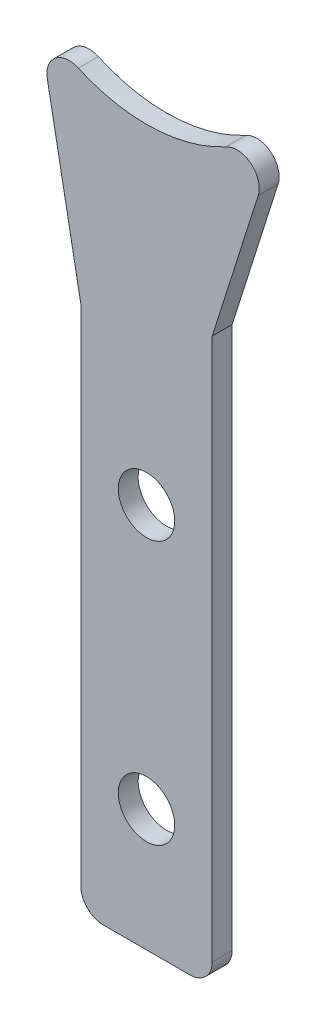
ISO-10303-21;
HEADER;
FILE_DESCRIPTION(('STEP AP214'),'2;1');
FILE_NAME('part.step','',(''),(''),'','','');
FILE_SCHEMA(('AUTOMOTIVE_DESIGN { 1 0 10303 214 1 1 1 1 }'));
ENDSEC;
DATA;
#1=APPLICATION_CONTEXT('core data for automotive mechanical design processes');
#2=APPLICATION_PROTOCOL_DEFINITION('international standard','automotive_design',2000,#1);
#3=PRODUCT_CONTEXT('',#1,'mechanical');
#4=PRODUCT('Part','Part','',(#3));
#5=PRODUCT_RELATED_PRODUCT_CATEGORY('part','',(#4));
#6=PRODUCT_DEFINITION_FORMATION('','',#4);
#7=PRODUCT_DEFINITION_CONTEXT('part definition',#1,'design');
#8=PRODUCT_DEFINITION('design','',#6,#7);
#9=PRODUCT_DEFINITION_SHAPE('','',#8);
#10=(LENGTH_UNIT() NAMED_UNIT(*) SI_UNIT(.MILLI.,.METRE.));
#11=(NAMED_UNIT(*) PLANE_ANGLE_UNIT() SI_UNIT($,.RADIAN.));
#12=(NAMED_UNIT(*) SI_UNIT($,.STERADIAN.) SOLID_ANGLE_UNIT());
#13=UNCERTAINTY_MEASURE_WITH_UNIT(LENGTH_MEASURE(1.E-05),#10,'distance_accuracy_value','');
#14=(GEOMETRIC_REPRESENTATION_CONTEXT(3) GLOBAL_UNCERTAINTY_ASSIGNED_CONTEXT((#13)) GLOBAL_UNIT_ASSIGNED_CONTEXT((#10,
#11,#12)) REPRESENTATION_CONTEXT('',''));
#15=CARTESIAN_POINT('',(0.,0.,0.));
#16=DIRECTION('',(0.,0.,1.));
#17=DIRECTION('',(1.,0.,0.));
#18=AXIS2_PLACEMENT_3D('',#15,#16,#17);
#19=CARTESIAN_POINT('',(0.,-25.6178665511832,1.5875));
#20=DIRECTION('',(0.,1.,0.));
#21=DIRECTION('',(0.,0.,1.));
#22=AXIS2_PLACEMENT_3D('',#19,#20,#21);
#23=PLANE('',#22);
#24=DIRECTION('',(1.,0.,0.));
#25=VECTOR('',#24,1.);
#26=CARTESIAN_POINT('',(0.,-25.6178665511832,0.));
#27=LINE('',#26,#25);
#28=CARTESIAN_POINT('',(-1.30092409853893,-25.6178665511832,0.));
#29=VERTEX_POINT('',#28);
#30=CARTESIAN_POINT('',(5.62126081661469,-25.6178665511832,0.));
#31=VERTEX_POINT('',#30);
#32=EDGE_CURVE('E156',#29,#31,#27,.T.);
#33=ORIENTED_EDGE('',*,*,#32,.T.);
#34=DIRECTION('',(0.,0.,-1.));
#35=VECTOR('',#34,1.);
#36=CARTESIAN_POINT('',(5.62126081661469,-25.6178665511832,1.5875));
#37=LINE('',#36,#35);
#38=CARTESIAN_POINT('',(5.62126081661469,-25.6178665511832,1.5875));
#39=VERTEX_POINT('',#38);
#40=EDGE_CURVE('E185',#31,#39,#37,.F.);
#41=ORIENTED_EDGE('',*,*,#40,.T.);
#42=DIRECTION('',(1.,0.,0.));
#43=VECTOR('',#42,1.);
#44=CARTESIAN_POINT('',(0.,-25.6178665511832,1.5875));
#45=LINE('',#44,#43);
#46=CARTESIAN_POINT('',(-1.30092409853893,-25.6178665511832,1.5875));
#47=VERTEX_POINT('',#46);
#48=EDGE_CURVE('E131',#47,#39,#45,.T.);
#49=ORIENTED_EDGE('',*,*,#48,.F.);
#50=DIRECTION('',(0.,0.,-1.));
#51=VECTOR('',#50,1.);
#52=CARTESIAN_POINT('',(-1.30092409853893,-25.6178665511832,0.));
#53=LINE('',#52,#51);
#54=EDGE_CURVE('E182',#47,#29,#53,.T.);
#55=ORIENTED_EDGE('',*,*,#54,.T.);
#56=EDGE_LOOP('',(#33,#41,#49,#55));
#57=FACE_BOUND('',#56,.T.);
#58=ADVANCED_FACE('F41',(#57),#23,.F.);
#59=CARTESIAN_POINT('',(7.39926081661469,0.,1.5875));
#60=DIRECTION('',(-1.,0.,0.));
#61=DIRECTION('',(0.,0.,1.));
#62=AXIS2_PLACEMENT_3D('',#59,#60,#61);
#63=PLANE('',#62);
#64=DIRECTION('',(0.,1.,0.));
#65=VECTOR('',#64,1.);
#66=CARTESIAN_POINT('',(7.39926081661469,0.,1.5875));
#67=LINE('',#66,#65);
#68=CARTESIAN_POINT('',(7.39926081661469,-23.8398665511832,1.5875));
#69=VERTEX_POINT('',#68);
#70=CARTESIAN_POINT('',(7.39926081661469,19.3814457813877,1.5875));
#71=VERTEX_POINT('',#70);
#72=EDGE_CURVE('E119',#69,#71,#67,.T.);
#73=ORIENTED_EDGE('',*,*,#72,.F.);
#74=DIRECTION('',(0.,0.,-1.));
#75=VECTOR('',#74,1.);
#76=CARTESIAN_POINT('',(7.39926081661469,-23.8398665511832,1.5875));
#77=LINE('',#76,#75);
#78=CARTESIAN_POINT('',(7.39926081661469,-23.8398665511832,0.));
#79=VERTEX_POINT('',#78);
#80=EDGE_CURVE('E141',#69,#79,#77,.T.);
#81=ORIENTED_EDGE('',*,*,#80,.T.);
#82=DIRECTION('',(0.,1.,0.));
#83=VECTOR('',#82,1.);
#84=CARTESIAN_POINT('',(7.39926081661469,0.,0.));
#85=LINE('',#84,#83);
#86=CARTESIAN_POINT('',(7.39926081661469,19.3814457813877,0.));
#87=VERTEX_POINT('',#86);
#88=EDGE_CURVE('E137',#79,#87,#85,.T.);
#89=ORIENTED_EDGE('',*,*,#88,.T.);
#90=DIRECTION('',(0.,0.,-1.));
#91=VECTOR('',#90,1.);
#92=CARTESIAN_POINT('',(7.39926081661469,19.3814457813877,1.5875));
#93=LINE('',#92,#91);
#94=EDGE_CURVE('E134',#71,#87,#93,.T.);
#95=ORIENTED_EDGE('',*,*,#94,.F.);
#96=EDGE_LOOP('',(#73,#81,#89,#95));
#97=FACE_BOUND('',#96,.T.);
#98=ADVANCED_FACE('F135',(#97),#63,.F.);
#99=CARTESIAN_POINT('',(1.12849676493406,-0.358488376376027,1.5875));
#100=DIRECTION('',(-0.953066906708529,0.30275975845055,0.));
#101=DIRECTION('',(-0.30275975845055,-0.953066906708529,0.));
#102=AXIS2_PLACEMENT_3D('',#99,#100,#101);
#103=PLANE('',#102);
#104=DIRECTION('',(0.30275975845055,0.953066906708529,0.));
#105=VECTOR('',#104,1.);
#106=CARTESIAN_POINT('',(1.12849676493406,-0.358488376376027,0.));
#107=LINE('',#106,#105);
#108=CARTESIAN_POINT('',(11.0626235557169,30.9134598501519,0.));
#109=VERTEX_POINT('',#108);
#110=EDGE_CURVE('E161',#87,#109,#107,.T.);
#111=ORIENTED_EDGE('',*,*,#110,.T.);
#112=DIRECTION('',(0.,0.,1.));
#113=VECTOR('',#112,1.);
#114=CARTESIAN_POINT('',(11.0626235557169,30.9134598501519,1.5875));
#115=LINE('',#114,#113);
#116=CARTESIAN_POINT('',(11.0626235557169,30.9134598501519,1.5875));
#117=VERTEX_POINT('',#116);
#118=EDGE_CURVE('E11',#109,#117,#115,.T.);
#119=ORIENTED_EDGE('',*,*,#118,.T.);
#120=DIRECTION('',(0.30275975845055,0.953066906708529,0.));
#121=VECTOR('',#120,1.);
#122=CARTESIAN_POINT('',(1.12849676493406,-0.358488376376027,1.5875));
#123=LINE('',#122,#121);
#124=EDGE_CURVE('E124',#71,#117,#123,.T.);
#125=ORIENTED_EDGE('',*,*,#124,.F.);
#126=ORIENTED_EDGE('',*,*,#94,.T.);
#127=EDGE_LOOP('',(#111,#119,#125,#126));
#128=FACE_BOUND('',#127,.T.);
#129=ADVANCED_FACE('F144',(#128),#103,.F.);
#130=CARTESIAN_POINT('',(2.15898559592923,44.5921334180742,1.5875));
#131=DIRECTION('',(0.,0.,-1.));
#132=DIRECTION('',(-1.,0.,0.));
#133=AXIS2_PLACEMENT_3D('',#130,#131,#132);
#134=CYLINDRICAL_SURFACE('',#133,13.21);
#135=CARTESIAN_POINT('',(2.15898559592923,44.5921334180742,0.));
#136=DIRECTION('',(0.,0.,1.));
#137=DIRECTION('',(1.,0.,0.));
#138=AXIS2_PLACEMENT_3D('',#135,#136,#137);
#139=CIRCLE('',#138,13.21);
#140=CARTESIAN_POINT('',(-3.27349058565369,32.5508584632974,0.));
#141=VERTEX_POINT('',#140);
#142=CARTESIAN_POINT('',(8.5128695594672,33.0105852237309,0.));
#143=VERTEX_POINT('',#142);
#144=EDGE_CURVE('E163',#141,#143,#139,.T.);
#145=ORIENTED_EDGE('',*,*,#144,.F.);
#146=DIRECTION('',(0.,0.,-1.));
#147=VECTOR('',#146,1.);
#148=CARTESIAN_POINT('',(-3.27349058565369,32.5508584632974,1.5875));
#149=LINE('',#148,#147);
#150=CARTESIAN_POINT('',(-3.27349058565369,32.5508584632974,1.5875));
#151=VERTEX_POINT('',#150);
#152=EDGE_CURVE('E49',#141,#151,#149,.F.);
#153=ORIENTED_EDGE('',*,*,#152,.T.);
#154=CARTESIAN_POINT('',(2.15898559592923,44.5921334180742,1.5875));
#155=DIRECTION('',(0.,0.,1.));
#156=DIRECTION('',(1.,0.,0.));
#157=AXIS2_PLACEMENT_3D('',#154,#155,#156);
#158=CIRCLE('',#157,13.21);
#159=CARTESIAN_POINT('',(8.5128695594672,33.0105852237309,1.5875));
#160=VERTEX_POINT('',#159);
#161=EDGE_CURVE('E146',#151,#160,#158,.T.);
#162=ORIENTED_EDGE('',*,*,#161,.T.);
#163=DIRECTION('',(0.,0.,-1.));
#164=VECTOR('',#163,1.);
#165=CARTESIAN_POINT('',(8.5128695594672,33.0105852237309,1.5875));
#166=LINE('',#165,#164);
#167=EDGE_CURVE('E197',#160,#143,#166,.T.);
#168=ORIENTED_EDGE('',*,*,#167,.T.);
#169=EDGE_LOOP('',(#145,#153,#162,#168));
#170=FACE_BOUND('',#169,.T.);
#171=ADVANCED_FACE('F202',(#170),#134,.F.);
#172=CARTESIAN_POINT('',(0.000739987598295849,0.00013911085449332,1.5875));
#173=DIRECTION('',(-0.982784708760391,-0.184754475525639,0.));
#174=DIRECTION('',(0.184754475525639,-0.982784708760391,0.));
#175=AXIS2_PLACEMENT_3D('',#172,#173,#174);
#176=PLANE('',#175);
#177=DIRECTION('',(-0.184754475525639,0.982784708760391,0.));
#178=VECTOR('',#177,1.);
#179=CARTESIAN_POINT('',(0.000739987598295849,0.00013911085449332,1.5875));
#180=LINE('',#179,#178);
#181=CARTESIAN_POINT('',(-3.07892409853893,16.3821334488168,1.5875));
#182=VERTEX_POINT('',#181);
#183=CARTESIAN_POINT('',(-5.7520659500518,30.6016695576983,1.5875));
#184=VERTEX_POINT('',#183);
#185=EDGE_CURVE('E149',#182,#184,#180,.T.);
#186=ORIENTED_EDGE('',*,*,#185,.T.);
#187=DIRECTION('',(0.,0.,-1.));
#188=VECTOR('',#187,1.);
#189=CARTESIAN_POINT('',(-5.7520659500518,30.6016695576983,1.5875));
#190=LINE('',#189,#188);
#191=CARTESIAN_POINT('',(-5.7520659500518,30.6016695576983,0.));
#192=VERTEX_POINT('',#191);
#193=EDGE_CURVE('E194',#184,#192,#190,.T.);
#194=ORIENTED_EDGE('',*,*,#193,.T.);
#195=DIRECTION('',(-0.184754475525639,0.982784708760391,0.));
#196=VECTOR('',#195,1.);
#197=CARTESIAN_POINT('',(0.000739987598295849,0.00013911085449332,0.));
#198=LINE('',#197,#196);
#199=CARTESIAN_POINT('',(-3.07892409853893,16.3821334488168,0.));
#200=VERTEX_POINT('',#199);
#201=EDGE_CURVE('E166',#200,#192,#198,.T.);
#202=ORIENTED_EDGE('',*,*,#201,.F.);
#203=DIRECTION('',(0.,0.,-1.));
#204=VECTOR('',#203,1.);
#205=CARTESIAN_POINT('',(-3.07892409853893,16.3821334488168,1.5875));
#206=LINE('',#205,#204);
#207=EDGE_CURVE('E142',#182,#200,#206,.T.);
#208=ORIENTED_EDGE('',*,*,#207,.F.);
#209=EDGE_LOOP('',(#186,#194,#202,#208));
#210=FACE_BOUND('',#209,.T.);
#211=ADVANCED_FACE('F209',(#210),#176,.T.);
#212=CARTESIAN_POINT('',(-3.07892409853893,0.,1.5875));
#213=DIRECTION('',(-1.,0.,0.));
#214=DIRECTION('',(0.,0.,1.));
#215=AXIS2_PLACEMENT_3D('',#212,#213,#214);
#216=PLANE('',#215);
#217=DIRECTION('',(0.,1.,0.));
#218=VECTOR('',#217,1.);
#219=CARTESIAN_POINT('',(-3.07892409853893,0.,0.));
#220=LINE('',#219,#218);
#221=CARTESIAN_POINT('',(-3.07892409853893,-23.8398665511832,0.));
#222=VERTEX_POINT('',#221);
#223=EDGE_CURVE('E169',#222,#200,#220,.T.);
#224=ORIENTED_EDGE('',*,*,#223,.F.);
#225=DIRECTION('',(0.,0.,-1.));
#226=VECTOR('',#225,1.);
#227=CARTESIAN_POINT('',(-3.07892409853893,-23.8398665511832,1.5875));
#228=LINE('',#227,#226);
#229=CARTESIAN_POINT('',(-3.07892409853893,-23.8398665511832,1.5875));
#230=VERTEX_POINT('',#229);
#231=EDGE_CURVE('E56',#222,#230,#228,.F.);
#232=ORIENTED_EDGE('',*,*,#231,.T.);
#233=DIRECTION('',(0.,1.,0.));
#234=VECTOR('',#233,1.);
#235=CARTESIAN_POINT('',(-3.07892409853893,0.,1.5875));
#236=LINE('',#235,#234);
#237=EDGE_CURVE('E154',#230,#182,#236,.T.);
#238=ORIENTED_EDGE('',*,*,#237,.T.);
#239=ORIENTED_EDGE('',*,*,#207,.T.);
#240=EDGE_LOOP('',(#224,#232,#238,#239));
#241=FACE_BOUND('',#240,.T.);
#242=ADVANCED_FACE('F214',(#241),#216,.T.);
#243=CARTESIAN_POINT('',(0.,0.,1.5875));
#244=DIRECTION('',(0.,0.,1.));
#245=DIRECTION('',(1.,0.,0.));
#246=AXIS2_PLACEMENT_3D('',#243,#244,#245);
#247=PLANE('',#246);
#248=CARTESIAN_POINT('',(2.16016835903788,5.10378426271273,1.5875));
#249=DIRECTION('',(0.,0.,1.));
#250=DIRECTION('',(1.,0.,0.));
#251=AXIS2_PLACEMENT_3D('',#248,#249,#250);
#252=CIRCLE('',#251,2.24999999999999);
#253=CARTESIAN_POINT('',(4.41016835903786,5.10378426271273,1.5875));
#254=VERTEX_POINT('',#253);
#255=EDGE_CURVE('E233',#254,#254,#252,.T.);
#256=ORIENTED_EDGE('',*,*,#255,.F.);
#257=EDGE_LOOP('',(#256));
#258=FACE_BOUND('',#257,.T.);
#259=CARTESIAN_POINT('',(2.16016835903789,-15.8958665511832,1.5875));
#260=DIRECTION('',(0.,0.,1.));
#261=DIRECTION('',(1.,0.,0.));
#262=AXIS2_PLACEMENT_3D('',#259,#260,#261);
#263=CIRCLE('',#262,2.24999999999999);
#264=CARTESIAN_POINT('',(4.41016835903787,-15.8958665511832,1.5875));
#265=VERTEX_POINT('',#264);
#266=EDGE_CURVE('E227',#265,#265,#263,.T.);
#267=ORIENTED_EDGE('',*,*,#266,.F.);
#268=EDGE_LOOP('',(#267));
#269=FACE_BOUND('',#268,.T.);
#270=ORIENTED_EDGE('',*,*,#48,.T.);
#271=CARTESIAN_POINT('',(5.62126081661469,-23.8398665511832,1.5875));
#272=DIRECTION('',(0.,0.,1.));
#273=DIRECTION('',(1.,0.,0.));
#274=AXIS2_PLACEMENT_3D('',#271,#272,#273);
#275=CIRCLE('',#274,1.778);
#276=EDGE_CURVE('E127',#39,#69,#275,.T.);
#277=ORIENTED_EDGE('',*,*,#276,.T.);
#278=ORIENTED_EDGE('',*,*,#72,.T.);
#279=ORIENTED_EDGE('',*,*,#124,.T.);
#280=CARTESIAN_POINT('',(9.36807059558911,31.451766700677,1.5875));
#281=DIRECTION('',(0.,0.,1.));
#282=DIRECTION('',(1.,0.,0.));
#283=AXIS2_PLACEMENT_3D('',#280,#281,#282);
#284=CIRCLE('',#283,1.778);
#285=EDGE_CURVE('E187',#117,#160,#284,.T.);
#286=ORIENTED_EDGE('',*,*,#285,.T.);
#287=ORIENTED_EDGE('',*,*,#161,.F.);
#288=CARTESIAN_POINT('',(-4.00467473787582,30.9301630151829,1.5875));
#289=DIRECTION('',(0.,0.,1.));
#290=DIRECTION('',(1.,0.,0.));
#291=AXIS2_PLACEMENT_3D('',#288,#289,#290);
#292=CIRCLE('',#291,1.778);
#293=EDGE_CURVE('E64',#151,#184,#292,.T.);
#294=ORIENTED_EDGE('',*,*,#293,.T.);
#295=ORIENTED_EDGE('',*,*,#185,.F.);
#296=ORIENTED_EDGE('',*,*,#237,.F.);
#297=CARTESIAN_POINT('',(-1.30092409853893,-23.8398665511832,1.5875));
#298=DIRECTION('',(0.,0.,1.));
#299=DIRECTION('',(1.,0.,0.));
#300=AXIS2_PLACEMENT_3D('',#297,#298,#299);
#301=CIRCLE('',#300,1.778);
#302=EDGE_CURVE('E190',#230,#47,#301,.T.);
#303=ORIENTED_EDGE('',*,*,#302,.T.);
#304=EDGE_LOOP('',(#270,#277,#278,#279,#286,#287,#294,#295,#296,#303));
#305=FACE_BOUND('',#304,.T.);
#306=ADVANCED_FACE('F122',(#258,#269,#305),#247,.T.);
#307=CARTESIAN_POINT('',(0.,0.,0.));
#308=DIRECTION('',(0.,0.,1.));
#309=DIRECTION('',(1.,0.,0.));
#310=AXIS2_PLACEMENT_3D('',#307,#308,#309);
#311=PLANE('',#310);
#312=CARTESIAN_POINT('',(2.16016835903788,5.10378426271273,0.));
#313=DIRECTION('',(0.,0.,1.));
#314=DIRECTION('',(1.,0.,0.));
#315=AXIS2_PLACEMENT_3D('',#312,#313,#314);
#316=CIRCLE('',#315,2.25);
#317=CARTESIAN_POINT('',(4.41016835903787,5.10378426271273,0.));
#318=VERTEX_POINT('',#317);
#319=EDGE_CURVE('E230',#318,#318,#316,.T.);
#320=ORIENTED_EDGE('',*,*,#319,.T.);
#321=EDGE_LOOP('',(#320));
#322=FACE_BOUND('',#321,.T.);
#323=CARTESIAN_POINT('',(2.16016835903789,-15.8958665511832,0.));
#324=DIRECTION('',(0.,0.,1.));
#325=DIRECTION('',(1.,0.,0.));
#326=AXIS2_PLACEMENT_3D('',#323,#324,#325);
#327=CIRCLE('',#326,2.25);
#328=CARTESIAN_POINT('',(4.41016835903789,-15.8958665511832,0.));
#329=VERTEX_POINT('',#328);
#330=EDGE_CURVE('E159',#329,#329,#327,.T.);
#331=ORIENTED_EDGE('',*,*,#330,.T.);
#332=EDGE_LOOP('',(#331));
#333=FACE_BOUND('',#332,.T.);
#334=ORIENTED_EDGE('',*,*,#88,.F.);
#335=CARTESIAN_POINT('',(5.62126081661469,-23.8398665511832,0.));
#336=DIRECTION('',(0.,0.,1.));
#337=DIRECTION('',(1.,0.,0.));
#338=AXIS2_PLACEMENT_3D('',#335,#336,#337);
#339=CIRCLE('',#338,1.778);
#340=EDGE_CURVE('E180',#79,#31,#339,.F.);
#341=ORIENTED_EDGE('',*,*,#340,.T.);
#342=ORIENTED_EDGE('',*,*,#32,.F.);
#343=CARTESIAN_POINT('',(-1.30092409853893,-23.8398665511832,0.));
#344=DIRECTION('',(0.,0.,1.));
#345=DIRECTION('',(1.,0.,0.));
#346=AXIS2_PLACEMENT_3D('',#343,#344,#345);
#347=CIRCLE('',#346,1.778);
#348=EDGE_CURVE('E178',#29,#222,#347,.F.);
#349=ORIENTED_EDGE('',*,*,#348,.T.);
#350=ORIENTED_EDGE('',*,*,#223,.T.);
#351=ORIENTED_EDGE('',*,*,#201,.T.);
#352=CARTESIAN_POINT('',(-4.00467473787582,30.9301630151829,0.));
#353=DIRECTION('',(0.,0.,1.));
#354=DIRECTION('',(1.,0.,0.));
#355=AXIS2_PLACEMENT_3D('',#352,#353,#354);
#356=CIRCLE('',#355,1.778);
#357=EDGE_CURVE('E176',#192,#141,#356,.F.);
#358=ORIENTED_EDGE('',*,*,#357,.T.);
#359=ORIENTED_EDGE('',*,*,#144,.T.);
#360=CARTESIAN_POINT('',(9.36807059558911,31.451766700677,0.));
#361=DIRECTION('',(0.,0.,1.));
#362=DIRECTION('',(1.,0.,0.));
#363=AXIS2_PLACEMENT_3D('',#360,#361,#362);
#364=CIRCLE('',#363,1.778);
#365=EDGE_CURVE('E174',#143,#109,#364,.F.);
#366=ORIENTED_EDGE('',*,*,#365,.T.);
#367=ORIENTED_EDGE('',*,*,#110,.F.);
#368=EDGE_LOOP('',(#334,#341,#342,#349,#350,#351,#358,#359,#366,#367));
#369=FACE_BOUND('',#368,.T.);
#370=ADVANCED_FACE('F212',(#322,#333,#369),#311,.F.);
#371=CARTESIAN_POINT('',(5.62126081661469,-23.8398665511832,1.5875));
#372=DIRECTION('',(0.,0.,-1.));
#373=DIRECTION('',(-1.,0.,0.));
#374=AXIS2_PLACEMENT_3D('',#371,#372,#373);
#375=CYLINDRICAL_SURFACE('',#374,1.778);
#376=ORIENTED_EDGE('',*,*,#276,.F.);
#377=ORIENTED_EDGE('',*,*,#40,.F.);
#378=ORIENTED_EDGE('',*,*,#340,.F.);
#379=ORIENTED_EDGE('',*,*,#80,.F.);
#380=EDGE_LOOP('',(#376,#377,#378,#379));
#381=FACE_BOUND('',#380,.T.);
#382=ADVANCED_FACE('F223',(#381),#375,.T.);
#383=CARTESIAN_POINT('',(-1.30092409853893,-23.8398665511832,1.5875));
#384=DIRECTION('',(0.,0.,1.));
#385=DIRECTION('',(1.,0.,0.));
#386=AXIS2_PLACEMENT_3D('',#383,#384,#385);
#387=CYLINDRICAL_SURFACE('',#386,1.778);
#388=ORIENTED_EDGE('',*,*,#302,.F.);
#389=ORIENTED_EDGE('',*,*,#231,.F.);
#390=ORIENTED_EDGE('',*,*,#348,.F.);
#391=ORIENTED_EDGE('',*,*,#54,.F.);
#392=EDGE_LOOP('',(#388,#389,#390,#391));
#393=FACE_BOUND('',#392,.T.);
#394=ADVANCED_FACE('F219',(#393),#387,.T.);
#395=CARTESIAN_POINT('',(-4.00467473787582,30.9301630151829,1.5875));
#396=DIRECTION('',(0.,0.,-1.));
#397=DIRECTION('',(-1.,0.,0.));
#398=AXIS2_PLACEMENT_3D('',#395,#396,#397);
#399=CYLINDRICAL_SURFACE('',#398,1.778);
#400=ORIENTED_EDGE('',*,*,#293,.F.);
#401=ORIENTED_EDGE('',*,*,#152,.F.);
#402=ORIENTED_EDGE('',*,*,#357,.F.);
#403=ORIENTED_EDGE('',*,*,#193,.F.);
#404=EDGE_LOOP('',(#400,#401,#402,#403));
#405=FACE_BOUND('',#404,.T.);
#406=ADVANCED_FACE('F206',(#405),#399,.T.);
#407=CARTESIAN_POINT('',(9.36807059558911,31.451766700677,1.5875));
#408=DIRECTION('',(0.,0.,-1.));
#409=DIRECTION('',(-1.,0.,0.));
#410=AXIS2_PLACEMENT_3D('',#407,#408,#409);
#411=CYLINDRICAL_SURFACE('',#410,1.778);
#412=ORIENTED_EDGE('',*,*,#285,.F.);
#413=ORIENTED_EDGE('',*,*,#118,.F.);
#414=ORIENTED_EDGE('',*,*,#365,.F.);
#415=ORIENTED_EDGE('',*,*,#167,.F.);
#416=EDGE_LOOP('',(#412,#413,#414,#415));
#417=FACE_BOUND('',#416,.T.);
#418=ADVANCED_FACE('F43',(#417),#411,.T.);
#419=CARTESIAN_POINT('',(2.16016835903789,-15.8958665511832,1.5875));
#420=DIRECTION('',(0.,0.,1.));
#421=DIRECTION('',(1.,0.,0.));
#422=AXIS2_PLACEMENT_3D('',#419,#420,#421);
#423=CYLINDRICAL_SURFACE('',#422,2.24999999999999);
#424=ORIENTED_EDGE('',*,*,#330,.F.);
#425=EDGE_LOOP('',(#424));
#426=FACE_BOUND('',#425,.T.);
#427=ORIENTED_EDGE('',*,*,#266,.T.);
#428=EDGE_LOOP('',(#427));
#429=FACE_BOUND('',#428,.T.);
#430=ADVANCED_FACE('F244',(#426,#429),#423,.F.);
#431=CARTESIAN_POINT('',(2.16016835903788,5.10378426271273,1.5875));
#432=DIRECTION('',(0.,0.,1.));
#433=DIRECTION('',(1.,0.,0.));
#434=AXIS2_PLACEMENT_3D('',#431,#432,#433);
#435=CYLINDRICAL_SURFACE('',#434,2.24999999999999);
#436=ORIENTED_EDGE('',*,*,#319,.F.);
#437=EDGE_LOOP('',(#436));
#438=FACE_BOUND('',#437,.T.);
#439=ORIENTED_EDGE('',*,*,#255,.T.);
#440=EDGE_LOOP('',(#439));
#441=FACE_BOUND('',#440,.T.);
#442=ADVANCED_FACE('F237',(#438,#441),#435,.F.);
#443=CLOSED_SHELL('',(#58,#98,#129,#171,#211,#242,#306,#370,#382,#394,#406,#418,#430,#442));
#444=MANIFOLD_SOLID_BREP('B2',#443);
#445=ADVANCED_BREP_SHAPE_REPRESENTATION('',(#18,#444),#14);
#446=SHAPE_DEFINITION_REPRESENTATION(#9,#445);
ENDSEC;
END-ISO-10303-21;
